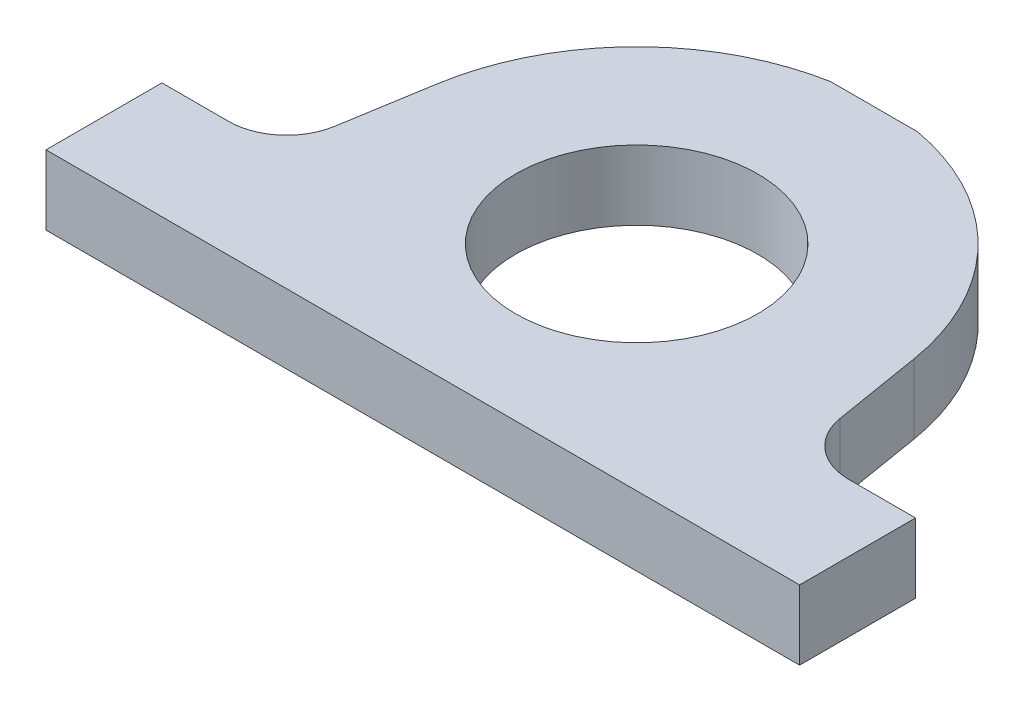
ISO-10303-21;
HEADER;
FILE_DESCRIPTION(('STEP AP214'),'2;1');
FILE_NAME('part.step','',(''),(''),'','','');
FILE_SCHEMA(('AUTOMOTIVE_DESIGN { 1 0 10303 214 1 1 1 1 }'));
ENDSEC;
DATA;
#1=APPLICATION_CONTEXT('core data for automotive mechanical design processes');
#2=APPLICATION_PROTOCOL_DEFINITION('international standard','automotive_design',2000,#1);
#3=PRODUCT_CONTEXT('',#1,'mechanical');
#4=PRODUCT('Part','Part','',(#3));
#5=PRODUCT_RELATED_PRODUCT_CATEGORY('part','',(#4));
#6=PRODUCT_DEFINITION_FORMATION('','',#4);
#7=PRODUCT_DEFINITION_CONTEXT('part definition',#1,'design');
#8=PRODUCT_DEFINITION('design','',#6,#7);
#9=PRODUCT_DEFINITION_SHAPE('','',#8);
#10=(LENGTH_UNIT() NAMED_UNIT(*) SI_UNIT(.MILLI.,.METRE.));
#11=(NAMED_UNIT(*) PLANE_ANGLE_UNIT() SI_UNIT($,.RADIAN.));
#12=(NAMED_UNIT(*) SI_UNIT($,.STERADIAN.) SOLID_ANGLE_UNIT());
#13=UNCERTAINTY_MEASURE_WITH_UNIT(LENGTH_MEASURE(1.E-05),#10,'distance_accuracy_value','');
#14=(GEOMETRIC_REPRESENTATION_CONTEXT(3) GLOBAL_UNCERTAINTY_ASSIGNED_CONTEXT((#13)) GLOBAL_UNIT_ASSIGNED_CONTEXT((#10,
#11,#12)) REPRESENTATION_CONTEXT('',''));
#15=CARTESIAN_POINT('',(0.,0.,0.));
#16=DIRECTION('',(0.,0.,1.));
#17=DIRECTION('',(1.,0.,0.));
#18=AXIS2_PLACEMENT_3D('',#15,#16,#17);
#19=CARTESIAN_POINT('',(0.,12.,0.));
#20=DIRECTION('',(0.,-1.,0.));
#21=DIRECTION('',(0.,0.,-1.));
#22=AXIS2_PLACEMENT_3D('',#19,#20,#21);
#23=CYLINDRICAL_SURFACE('',#22,41.65);
#24=CARTESIAN_POINT('',(0.,12.,0.));
#25=DIRECTION('',(0.,1.,0.));
#26=DIRECTION('',(0.,0.,1.));
#27=AXIS2_PLACEMENT_3D('',#24,#25,#26);
#28=CIRCLE('',#27,41.65);
#29=CARTESIAN_POINT('',(-7.5,12.,-40.9691652343564));
#30=VERTEX_POINT('',#29);
#31=CARTESIAN_POINT('',(-41.0948202807787,12.,-6.77777589556466));
#32=VERTEX_POINT('',#31);
#33=EDGE_CURVE('E136',#30,#32,#28,.T.);
#34=ORIENTED_EDGE('',*,*,#33,.F.);
#35=DIRECTION('',(0.,-1.,0.));
#36=VECTOR('',#35,1.);
#37=CARTESIAN_POINT('',(-7.5,12.,-40.9691652343564));
#38=LINE('',#37,#36);
#39=CARTESIAN_POINT('',(-7.5,0.,-40.9691652343564));
#40=VERTEX_POINT('',#39);
#41=EDGE_CURVE('E122',#30,#40,#38,.T.);
#42=ORIENTED_EDGE('',*,*,#41,.T.);
#43=CARTESIAN_POINT('',(0.,0.,0.));
#44=DIRECTION('',(0.,1.,0.));
#45=DIRECTION('',(0.,0.,1.));
#46=AXIS2_PLACEMENT_3D('',#43,#44,#45);
#47=CIRCLE('',#46,41.65);
#48=CARTESIAN_POINT('',(-41.0948202807787,0.,-6.77777589556466));
#49=VERTEX_POINT('',#48);
#50=EDGE_CURVE('E165',#40,#49,#47,.T.);
#51=ORIENTED_EDGE('',*,*,#50,.T.);
#52=DIRECTION('',(0.,-1.,0.));
#53=VECTOR('',#52,1.);
#54=CARTESIAN_POINT('',(-41.0948202807787,12.,-6.77777589556466));
#55=LINE('',#54,#53);
#56=EDGE_CURVE('E142',#32,#49,#55,.T.);
#57=ORIENTED_EDGE('',*,*,#56,.F.);
#58=EDGE_LOOP('',(#34,#42,#51,#57));
#59=FACE_BOUND('',#58,.T.);
#60=ADVANCED_FACE('F34',(#59),#23,.T.);
#61=CARTESIAN_POINT('',(0.,12.,0.));
#62=DIRECTION('',(0.,1.,0.));
#63=DIRECTION('',(0.,0.,1.));
#64=AXIS2_PLACEMENT_3D('',#61,#62,#63);
#65=PLANE('',#64);
#66=DIRECTION('',(-1.,0.,0.));
#67=VECTOR('',#66,1.);
#68=CARTESIAN_POINT('',(7.5,12.,-40.9691652343564));
#69=LINE('',#68,#67);
#70=CARTESIAN_POINT('',(7.5,12.,-40.9691652343564));
#71=VERTEX_POINT('',#70);
#72=EDGE_CURVE('E49',#71,#30,#69,.T.);
#73=ORIENTED_EDGE('',*,*,#72,.T.);
#74=ORIENTED_EDGE('',*,*,#33,.T.);
#75=DIRECTION('',(-0.162731714179224,0.,0.986670354880642));
#76=VECTOR('',#75,1.);
#77=CARTESIAN_POINT('',(-41.0948202807787,12.,-6.77777589556466));
#78=LINE('',#77,#76);
#79=CARTESIAN_POINT('',(-43.6190919519823,12.,8.52731714179223));
#80=VERTEX_POINT('',#79);
#81=EDGE_CURVE('E145',#32,#80,#78,.T.);
#82=ORIENTED_EDGE('',*,*,#81,.T.);
#83=CARTESIAN_POINT('',(-53.4857955007887,12.,6.9));
#84=DIRECTION('',(0.,1.,0.));
#85=DIRECTION('',(0.,0.,1.));
#86=AXIS2_PLACEMENT_3D('',#83,#84,#85);
#87=CIRCLE('',#86,10.);
#88=CARTESIAN_POINT('',(-53.4857955007887,12.,16.9));
#89=VERTEX_POINT('',#88);
#90=EDGE_CURVE('E11',#80,#89,#87,.F.);
#91=ORIENTED_EDGE('',*,*,#90,.T.);
#92=DIRECTION('',(-1.,0.,0.));
#93=VECTOR('',#92,1.);
#94=CARTESIAN_POINT('',(-65.,12.,16.9));
#95=LINE('',#94,#93);
#96=CARTESIAN_POINT('',(-65.,12.,16.9));
#97=VERTEX_POINT('',#96);
#98=EDGE_CURVE('E171',#89,#97,#95,.T.);
#99=ORIENTED_EDGE('',*,*,#98,.T.);
#100=DIRECTION('',(0.,0.,1.));
#101=VECTOR('',#100,1.);
#102=CARTESIAN_POINT('',(-65.,12.,16.9));
#103=LINE('',#102,#101);
#104=CARTESIAN_POINT('',(-65.,12.,36.9));
#105=VERTEX_POINT('',#104);
#106=EDGE_CURVE('E215',#97,#105,#103,.T.);
#107=ORIENTED_EDGE('',*,*,#106,.T.);
#108=DIRECTION('',(1.,0.,0.));
#109=VECTOR('',#108,1.);
#110=CARTESIAN_POINT('',(-65.,12.,36.9));
#111=LINE('',#110,#109);
#112=CARTESIAN_POINT('',(65.,12.,36.9));
#113=VERTEX_POINT('',#112);
#114=EDGE_CURVE('E217',#105,#113,#111,.T.);
#115=ORIENTED_EDGE('',*,*,#114,.T.);
#116=DIRECTION('',(0.,0.,-1.));
#117=VECTOR('',#116,1.);
#118=CARTESIAN_POINT('',(65.,12.,16.9));
#119=LINE('',#118,#117);
#120=CARTESIAN_POINT('',(65.,12.,16.9));
#121=VERTEX_POINT('',#120);
#122=EDGE_CURVE('E224',#113,#121,#119,.T.);
#123=ORIENTED_EDGE('',*,*,#122,.T.);
#124=DIRECTION('',(-1.,0.,0.));
#125=VECTOR('',#124,1.);
#126=CARTESIAN_POINT('',(45.,12.,16.9));
#127=LINE('',#126,#125);
#128=CARTESIAN_POINT('',(53.4857955007887,12.,16.9));
#129=VERTEX_POINT('',#128);
#130=EDGE_CURVE('E146',#121,#129,#127,.T.);
#131=ORIENTED_EDGE('',*,*,#130,.T.);
#132=CARTESIAN_POINT('',(53.4857955007887,12.,6.89999999999999));
#133=DIRECTION('',(0.,1.,0.));
#134=DIRECTION('',(0.,0.,1.));
#135=AXIS2_PLACEMENT_3D('',#132,#133,#134);
#136=CIRCLE('',#135,10.);
#137=CARTESIAN_POINT('',(43.6190919519823,12.,8.52731714179222));
#138=VERTEX_POINT('',#137);
#139=EDGE_CURVE('E199',#129,#138,#136,.F.);
#140=ORIENTED_EDGE('',*,*,#139,.T.);
#141=DIRECTION('',(-0.162731714179224,0.,-0.986670354880642));
#142=VECTOR('',#141,1.);
#143=CARTESIAN_POINT('',(41.0948202807787,12.,-6.77777589556467));
#144=LINE('',#143,#142);
#145=CARTESIAN_POINT('',(41.0948202807787,12.,-6.77777589556467));
#146=VERTEX_POINT('',#145);
#147=EDGE_CURVE('E143',#138,#146,#144,.T.);
#148=ORIENTED_EDGE('',*,*,#147,.T.);
#149=EDGE_CURVE('E139',#146,#71,#28,.T.);
#150=ORIENTED_EDGE('',*,*,#149,.T.);
#151=EDGE_LOOP('',(#73,#74,#82,#91,#99,#107,#115,#123,#131,#140,#148,#150));
#152=FACE_BOUND('',#151,.T.);
#153=CARTESIAN_POINT('',(0.,12.,0.));
#154=DIRECTION('',(0.,1.,0.));
#155=DIRECTION('',(0.,0.,1.));
#156=AXIS2_PLACEMENT_3D('',#153,#154,#155);
#157=CIRCLE('',#156,20.9);
#158=CARTESIAN_POINT('',(0.,12.,20.9));
#159=VERTEX_POINT('',#158);
#160=EDGE_CURVE('E154',#159,#159,#157,.T.);
#161=ORIENTED_EDGE('',*,*,#160,.F.);
#162=EDGE_LOOP('',(#161));
#163=FACE_BOUND('',#162,.T.);
#164=ADVANCED_FACE('F134',(#152,#163),#65,.T.);
#165=CARTESIAN_POINT('',(0.,0.,0.));
#166=DIRECTION('',(0.,1.,0.));
#167=DIRECTION('',(0.,0.,1.));
#168=AXIS2_PLACEMENT_3D('',#165,#166,#167);
#169=PLANE('',#168);
#170=ORIENTED_EDGE('',*,*,#50,.F.);
#171=DIRECTION('',(-1.,0.,0.));
#172=VECTOR('',#171,1.);
#173=CARTESIAN_POINT('',(7.5,0.,-40.9691652343564));
#174=LINE('',#173,#172);
#175=CARTESIAN_POINT('',(7.5,0.,-40.9691652343564));
#176=VERTEX_POINT('',#175);
#177=EDGE_CURVE('E125',#176,#40,#174,.T.);
#178=ORIENTED_EDGE('',*,*,#177,.F.);
#179=CARTESIAN_POINT('',(41.0948202807787,0.,-6.77777589556467));
#180=VERTEX_POINT('',#179);
#181=EDGE_CURVE('E166',#180,#176,#47,.T.);
#182=ORIENTED_EDGE('',*,*,#181,.F.);
#183=DIRECTION('',(-0.162731714179224,0.,-0.986670354880642));
#184=VECTOR('',#183,1.);
#185=CARTESIAN_POINT('',(41.0948202807787,0.,-6.77777589556467));
#186=LINE('',#185,#184);
#187=CARTESIAN_POINT('',(43.6190919519823,0.,8.52731714179222));
#188=VERTEX_POINT('',#187);
#189=EDGE_CURVE('E163',#188,#180,#186,.T.);
#190=ORIENTED_EDGE('',*,*,#189,.F.);
#191=CARTESIAN_POINT('',(53.4857955007887,0.,6.89999999999999));
#192=DIRECTION('',(0.,1.,0.));
#193=DIRECTION('',(0.,0.,1.));
#194=AXIS2_PLACEMENT_3D('',#191,#192,#193);
#195=CIRCLE('',#194,10.);
#196=CARTESIAN_POINT('',(53.4857955007887,0.,16.9));
#197=VERTEX_POINT('',#196);
#198=EDGE_CURVE('E197',#188,#197,#195,.T.);
#199=ORIENTED_EDGE('',*,*,#198,.T.);
#200=DIRECTION('',(-1.,0.,0.));
#201=VECTOR('',#200,1.);
#202=CARTESIAN_POINT('',(45.,0.,16.9));
#203=LINE('',#202,#201);
#204=CARTESIAN_POINT('',(65.,0.,16.9));
#205=VERTEX_POINT('',#204);
#206=EDGE_CURVE('E160',#205,#197,#203,.T.);
#207=ORIENTED_EDGE('',*,*,#206,.F.);
#208=DIRECTION('',(0.,0.,-1.));
#209=VECTOR('',#208,1.);
#210=CARTESIAN_POINT('',(65.,0.,16.9));
#211=LINE('',#210,#209);
#212=CARTESIAN_POINT('',(65.,0.,36.9));
#213=VERTEX_POINT('',#212);
#214=EDGE_CURVE('E158',#213,#205,#211,.T.);
#215=ORIENTED_EDGE('',*,*,#214,.F.);
#216=DIRECTION('',(1.,0.,0.));
#217=VECTOR('',#216,1.);
#218=CARTESIAN_POINT('',(-65.,0.,36.9));
#219=LINE('',#218,#217);
#220=CARTESIAN_POINT('',(-65.,0.,36.9));
#221=VERTEX_POINT('',#220);
#222=EDGE_CURVE('E156',#221,#213,#219,.T.);
#223=ORIENTED_EDGE('',*,*,#222,.F.);
#224=DIRECTION('',(0.,0.,1.));
#225=VECTOR('',#224,1.);
#226=CARTESIAN_POINT('',(-65.,0.,16.9));
#227=LINE('',#226,#225);
#228=CARTESIAN_POINT('',(-65.,0.,16.9));
#229=VERTEX_POINT('',#228);
#230=EDGE_CURVE('E153',#229,#221,#227,.T.);
#231=ORIENTED_EDGE('',*,*,#230,.F.);
#232=DIRECTION('',(-1.,0.,0.));
#233=VECTOR('',#232,1.);
#234=CARTESIAN_POINT('',(-65.,0.,16.9));
#235=LINE('',#234,#233);
#236=CARTESIAN_POINT('',(-53.4857955007887,0.,16.9));
#237=VERTEX_POINT('',#236);
#238=EDGE_CURVE('E151',#237,#229,#235,.T.);
#239=ORIENTED_EDGE('',*,*,#238,.F.);
#240=CARTESIAN_POINT('',(-53.4857955007887,0.,6.9));
#241=DIRECTION('',(0.,1.,0.));
#242=DIRECTION('',(0.,0.,1.));
#243=AXIS2_PLACEMENT_3D('',#240,#241,#242);
#244=CIRCLE('',#243,10.);
#245=CARTESIAN_POINT('',(-43.6190919519823,0.,8.52731714179223));
#246=VERTEX_POINT('',#245);
#247=EDGE_CURVE('E42',#237,#246,#244,.T.);
#248=ORIENTED_EDGE('',*,*,#247,.T.);
#249=DIRECTION('',(-0.162731714179224,0.,0.986670354880642));
#250=VECTOR('',#249,1.);
#251=CARTESIAN_POINT('',(-41.0948202807787,0.,-6.77777589556466));
#252=LINE('',#251,#250);
#253=EDGE_CURVE('E169',#49,#246,#252,.T.);
#254=ORIENTED_EDGE('',*,*,#253,.F.);
#255=EDGE_LOOP('',(#170,#178,#182,#190,#199,#207,#215,#223,#231,#239,#248,#254));
#256=FACE_BOUND('',#255,.T.);
#257=CARTESIAN_POINT('',(0.,0.,0.));
#258=DIRECTION('',(0.,1.,0.));
#259=DIRECTION('',(0.,0.,1.));
#260=AXIS2_PLACEMENT_3D('',#257,#258,#259);
#261=CIRCLE('',#260,20.9);
#262=CARTESIAN_POINT('',(0.,0.,20.9));
#263=VERTEX_POINT('',#262);
#264=EDGE_CURVE('E220',#263,#263,#261,.T.);
#265=ORIENTED_EDGE('',*,*,#264,.T.);
#266=EDGE_LOOP('',(#265));
#267=FACE_BOUND('',#266,.T.);
#268=ADVANCED_FACE('F203',(#256,#267),#169,.F.);
#269=CARTESIAN_POINT('',(-65.,12.,16.9));
#270=DIRECTION('',(0.,0.,1.));
#271=DIRECTION('',(1.,0.,0.));
#272=AXIS2_PLACEMENT_3D('',#269,#270,#271);
#273=PLANE('',#272);
#274=CARTESIAN_POINT('',(-55.,6.,16.9));
#275=DIRECTION('',(0.,0.,-1.));
#276=DIRECTION('',(-1.,0.,0.));
#277=AXIS2_PLACEMENT_3D('',#274,#275,#276);
#278=CIRCLE('',#277,0.999999999999998);
#279=CARTESIAN_POINT('',(-56.,6.,16.9));
#280=VERTEX_POINT('',#279);
#281=EDGE_CURVE('E129',#280,#280,#278,.T.);
#282=ORIENTED_EDGE('',*,*,#281,.F.);
#283=EDGE_LOOP('',(#282));
#284=FACE_BOUND('',#283,.T.);
#285=ORIENTED_EDGE('',*,*,#98,.F.);
#286=DIRECTION('',(0.,-1.,0.));
#287=VECTOR('',#286,1.);
#288=CARTESIAN_POINT('',(-53.4857955007887,0.,16.9));
#289=LINE('',#288,#287);
#290=EDGE_CURVE('E193',#89,#237,#289,.T.);
#291=ORIENTED_EDGE('',*,*,#290,.T.);
#292=ORIENTED_EDGE('',*,*,#238,.T.);
#293=DIRECTION('',(0.,-1.,0.));
#294=VECTOR('',#293,1.);
#295=CARTESIAN_POINT('',(-65.,12.,16.9));
#296=LINE('',#295,#294);
#297=EDGE_CURVE('E185',#97,#229,#296,.T.);
#298=ORIENTED_EDGE('',*,*,#297,.F.);
#299=EDGE_LOOP('',(#285,#291,#292,#298));
#300=FACE_BOUND('',#299,.T.);
#301=ADVANCED_FACE('F214',(#284,#300),#273,.F.);
#302=CARTESIAN_POINT('',(-65.,12.,16.9));
#303=DIRECTION('',(1.,0.,0.));
#304=DIRECTION('',(0.,0.,-1.));
#305=AXIS2_PLACEMENT_3D('',#302,#303,#304);
#306=PLANE('',#305);
#307=ORIENTED_EDGE('',*,*,#230,.T.);
#308=DIRECTION('',(0.,-1.,0.));
#309=VECTOR('',#308,1.);
#310=CARTESIAN_POINT('',(-65.,12.,36.9));
#311=LINE('',#310,#309);
#312=EDGE_CURVE('E182',#105,#221,#311,.T.);
#313=ORIENTED_EDGE('',*,*,#312,.F.);
#314=ORIENTED_EDGE('',*,*,#106,.F.);
#315=ORIENTED_EDGE('',*,*,#297,.T.);
#316=EDGE_LOOP('',(#307,#313,#314,#315));
#317=FACE_BOUND('',#316,.T.);
#318=ADVANCED_FACE('F300',(#317),#306,.F.);
#319=CARTESIAN_POINT('',(-65.,12.,36.9));
#320=DIRECTION('',(0.,0.,-1.));
#321=DIRECTION('',(-1.,0.,0.));
#322=AXIS2_PLACEMENT_3D('',#319,#320,#321);
#323=PLANE('',#322);
#324=ORIENTED_EDGE('',*,*,#222,.T.);
#325=DIRECTION('',(0.,-1.,0.));
#326=VECTOR('',#325,1.);
#327=CARTESIAN_POINT('',(65.,12.,36.9));
#328=LINE('',#327,#326);
#329=EDGE_CURVE('E179',#113,#213,#328,.T.);
#330=ORIENTED_EDGE('',*,*,#329,.F.);
#331=ORIENTED_EDGE('',*,*,#114,.F.);
#332=ORIENTED_EDGE('',*,*,#312,.T.);
#333=EDGE_LOOP('',(#324,#330,#331,#332));
#334=FACE_BOUND('',#333,.T.);
#335=ADVANCED_FACE('F296',(#334),#323,.F.);
#336=CARTESIAN_POINT('',(65.,12.,16.9));
#337=DIRECTION('',(-1.,0.,0.));
#338=DIRECTION('',(0.,0.,1.));
#339=AXIS2_PLACEMENT_3D('',#336,#337,#338);
#340=PLANE('',#339);
#341=ORIENTED_EDGE('',*,*,#214,.T.);
#342=DIRECTION('',(0.,-1.,0.));
#343=VECTOR('',#342,1.);
#344=CARTESIAN_POINT('',(65.,12.,16.9));
#345=LINE('',#344,#343);
#346=EDGE_CURVE('E176',#121,#205,#345,.T.);
#347=ORIENTED_EDGE('',*,*,#346,.F.);
#348=ORIENTED_EDGE('',*,*,#122,.F.);
#349=ORIENTED_EDGE('',*,*,#329,.T.);
#350=EDGE_LOOP('',(#341,#347,#348,#349));
#351=FACE_BOUND('',#350,.T.);
#352=ADVANCED_FACE('F290',(#351),#340,.F.);
#353=CARTESIAN_POINT('',(45.,12.,16.9));
#354=DIRECTION('',(0.,0.,1.));
#355=DIRECTION('',(1.,0.,0.));
#356=AXIS2_PLACEMENT_3D('',#353,#354,#355);
#357=PLANE('',#356);
#358=CARTESIAN_POINT('',(55.,6.,16.9));
#359=DIRECTION('',(0.,0.,-1.));
#360=DIRECTION('',(-1.,0.,0.));
#361=AXIS2_PLACEMENT_3D('',#358,#359,#360);
#362=CIRCLE('',#361,0.999999999999998);
#363=CARTESIAN_POINT('',(54.,6.,16.9));
#364=VERTEX_POINT('',#363);
#365=EDGE_CURVE('E250',#364,#364,#362,.T.);
#366=ORIENTED_EDGE('',*,*,#365,.F.);
#367=EDGE_LOOP('',(#366));
#368=FACE_BOUND('',#367,.T.);
#369=ORIENTED_EDGE('',*,*,#206,.T.);
#370=DIRECTION('',(0.,-1.,0.));
#371=VECTOR('',#370,1.);
#372=CARTESIAN_POINT('',(53.4857955007887,12.,16.9));
#373=LINE('',#372,#371);
#374=EDGE_CURVE('E191',#197,#129,#373,.F.);
#375=ORIENTED_EDGE('',*,*,#374,.T.);
#376=ORIENTED_EDGE('',*,*,#130,.F.);
#377=ORIENTED_EDGE('',*,*,#346,.T.);
#378=EDGE_LOOP('',(#369,#375,#376,#377));
#379=FACE_BOUND('',#378,.T.);
#380=ADVANCED_FACE('F286',(#368,#379),#357,.F.);
#381=CARTESIAN_POINT('',(41.0948202807787,12.,-6.77777589556467));
#382=DIRECTION('',(-0.986670354880642,0.,0.162731714179224));
#383=DIRECTION('',(0.162731714179224,0.,0.986670354880642));
#384=AXIS2_PLACEMENT_3D('',#381,#382,#383);
#385=PLANE('',#384);
#386=ORIENTED_EDGE('',*,*,#147,.F.);
#387=DIRECTION('',(0.,-1.,0.));
#388=VECTOR('',#387,1.);
#389=CARTESIAN_POINT('',(43.6190919519823,0.,8.52731714179222));
#390=LINE('',#389,#388);
#391=EDGE_CURVE('E188',#138,#188,#390,.T.);
#392=ORIENTED_EDGE('',*,*,#391,.T.);
#393=ORIENTED_EDGE('',*,*,#189,.T.);
#394=DIRECTION('',(0.,-1.,0.));
#395=VECTOR('',#394,1.);
#396=CARTESIAN_POINT('',(41.0948202807787,12.,-6.77777589556467));
#397=LINE('',#396,#395);
#398=EDGE_CURVE('E173',#146,#180,#397,.T.);
#399=ORIENTED_EDGE('',*,*,#398,.F.);
#400=EDGE_LOOP('',(#386,#392,#393,#399));
#401=FACE_BOUND('',#400,.T.);
#402=ADVANCED_FACE('F238',(#401),#385,.F.);
#403=ORIENTED_EDGE('',*,*,#181,.T.);
#404=DIRECTION('',(0.,-1.,0.));
#405=VECTOR('',#404,1.);
#406=CARTESIAN_POINT('',(7.5,12.,-40.9691652343564));
#407=LINE('',#406,#405);
#408=EDGE_CURVE('E130',#71,#176,#407,.T.);
#409=ORIENTED_EDGE('',*,*,#408,.F.);
#410=ORIENTED_EDGE('',*,*,#149,.F.);
#411=ORIENTED_EDGE('',*,*,#398,.T.);
#412=EDGE_LOOP('',(#403,#409,#410,#411));
#413=FACE_BOUND('',#412,.T.);
#414=ADVANCED_FACE('F243',(#413),#23,.T.);
#415=CARTESIAN_POINT('',(-41.0948202807787,12.,-6.77777589556466));
#416=DIRECTION('',(0.986670354880642,0.,0.162731714179224));
#417=DIRECTION('',(0.162731714179224,0.,-0.986670354880642));
#418=AXIS2_PLACEMENT_3D('',#415,#416,#417);
#419=PLANE('',#418);
#420=ORIENTED_EDGE('',*,*,#253,.T.);
#421=DIRECTION('',(0.,-1.,0.));
#422=VECTOR('',#421,1.);
#423=CARTESIAN_POINT('',(-43.6190919519823,12.,8.52731714179224));
#424=LINE('',#423,#422);
#425=EDGE_CURVE('E57',#246,#80,#424,.F.);
#426=ORIENTED_EDGE('',*,*,#425,.T.);
#427=ORIENTED_EDGE('',*,*,#81,.F.);
#428=ORIENTED_EDGE('',*,*,#56,.T.);
#429=EDGE_LOOP('',(#420,#426,#427,#428));
#430=FACE_BOUND('',#429,.T.);
#431=ADVANCED_FACE('F208',(#430),#419,.F.);
#432=CARTESIAN_POINT('',(0.,12.,0.));
#433=DIRECTION('',(0.,-1.,0.));
#434=DIRECTION('',(0.,0.,-1.));
#435=AXIS2_PLACEMENT_3D('',#432,#433,#434);
#436=CYLINDRICAL_SURFACE('',#435,20.9);
#437=ORIENTED_EDGE('',*,*,#160,.T.);
#438=EDGE_LOOP('',(#437));
#439=FACE_BOUND('',#438,.T.);
#440=ORIENTED_EDGE('',*,*,#264,.F.);
#441=EDGE_LOOP('',(#440));
#442=FACE_BOUND('',#441,.T.);
#443=ADVANCED_FACE('F263',(#439,#442),#436,.F.);
#444=CARTESIAN_POINT('',(55.,6.,19.9));
#445=DIRECTION('',(0.,0.,-1.));
#446=DIRECTION('',(-1.,0.,0.));
#447=AXIS2_PLACEMENT_3D('',#444,#445,#446);
#448=CYLINDRICAL_SURFACE('',#447,0.999999999999998);
#449=CARTESIAN_POINT('',(55.,6.,19.9));
#450=DIRECTION('',(0.,0.,-1.));
#451=DIRECTION('',(-1.,0.,0.));
#452=AXIS2_PLACEMENT_3D('',#449,#450,#451);
#453=CIRCLE('',#452,0.999999999999998);
#454=CARTESIAN_POINT('',(54.,6.,19.9));
#455=VERTEX_POINT('',#454);
#456=EDGE_CURVE('E253',#455,#455,#453,.T.);
#457=ORIENTED_EDGE('',*,*,#456,.F.);
#458=EDGE_LOOP('',(#457));
#459=FACE_BOUND('',#458,.T.);
#460=ORIENTED_EDGE('',*,*,#365,.T.);
#461=EDGE_LOOP('',(#460));
#462=FACE_BOUND('',#461,.T.);
#463=ADVANCED_FACE('F265',(#459,#462),#448,.F.);
#464=CARTESIAN_POINT('',(55.,6.,19.9));
#465=DIRECTION('',(0.,0.,-1.));
#466=DIRECTION('',(-1.,0.,0.));
#467=AXIS2_PLACEMENT_3D('',#464,#465,#466);
#468=PLANE('',#467);
#469=ORIENTED_EDGE('',*,*,#456,.T.);
#470=EDGE_LOOP('',(#469));
#471=FACE_BOUND('',#470,.T.);
#472=ADVANCED_FACE('F271',(#471),#468,.T.);
#473=CARTESIAN_POINT('',(-55.,6.,19.9));
#474=DIRECTION('',(0.,0.,-1.));
#475=DIRECTION('',(-1.,0.,0.));
#476=AXIS2_PLACEMENT_3D('',#473,#474,#475);
#477=CYLINDRICAL_SURFACE('',#476,0.999999999999998);
#478=CARTESIAN_POINT('',(-55.,6.,19.9));
#479=DIRECTION('',(0.,0.,-1.));
#480=DIRECTION('',(-1.,0.,0.));
#481=AXIS2_PLACEMENT_3D('',#478,#479,#480);
#482=CIRCLE('',#481,0.999999999999998);
#483=CARTESIAN_POINT('',(-56.,6.,19.9));
#484=VERTEX_POINT('',#483);
#485=EDGE_CURVE('E247',#484,#484,#482,.T.);
#486=ORIENTED_EDGE('',*,*,#485,.F.);
#487=EDGE_LOOP('',(#486));
#488=FACE_BOUND('',#487,.T.);
#489=ORIENTED_EDGE('',*,*,#281,.T.);
#490=EDGE_LOOP('',(#489));
#491=FACE_BOUND('',#490,.T.);
#492=ADVANCED_FACE('F313',(#488,#491),#477,.F.);
#493=CARTESIAN_POINT('',(-55.,6.,19.9));
#494=DIRECTION('',(0.,0.,-1.));
#495=DIRECTION('',(-1.,0.,0.));
#496=AXIS2_PLACEMENT_3D('',#493,#494,#495);
#497=PLANE('',#496);
#498=ORIENTED_EDGE('',*,*,#485,.T.);
#499=EDGE_LOOP('',(#498));
#500=FACE_BOUND('',#499,.T.);
#501=ADVANCED_FACE('F308',(#500),#497,.T.);
#502=CARTESIAN_POINT('',(53.4857955007887,12.,6.89999999999999));
#503=DIRECTION('',(0.,1.,0.));
#504=DIRECTION('',(0.,0.,1.));
#505=AXIS2_PLACEMENT_3D('',#502,#503,#504);
#506=CYLINDRICAL_SURFACE('',#505,10.);
#507=ORIENTED_EDGE('',*,*,#139,.F.);
#508=ORIENTED_EDGE('',*,*,#374,.F.);
#509=ORIENTED_EDGE('',*,*,#198,.F.);
#510=ORIENTED_EDGE('',*,*,#391,.F.);
#511=EDGE_LOOP('',(#507,#508,#509,#510));
#512=FACE_BOUND('',#511,.T.);
#513=ADVANCED_FACE('F235',(#512),#506,.F.);
#514=CARTESIAN_POINT('',(-53.4857955007887,12.,6.9));
#515=DIRECTION('',(0.,1.,0.));
#516=DIRECTION('',(0.,0.,1.));
#517=AXIS2_PLACEMENT_3D('',#514,#515,#516);
#518=CYLINDRICAL_SURFACE('',#517,10.);
#519=ORIENTED_EDGE('',*,*,#90,.F.);
#520=ORIENTED_EDGE('',*,*,#425,.F.);
#521=ORIENTED_EDGE('',*,*,#247,.F.);
#522=ORIENTED_EDGE('',*,*,#290,.F.);
#523=EDGE_LOOP('',(#519,#520,#521,#522));
#524=FACE_BOUND('',#523,.T.);
#525=ADVANCED_FACE('F36',(#524),#518,.F.);
#526=CARTESIAN_POINT('',(7.5,12.,-40.9691652343564));
#527=DIRECTION('',(0.,0.,1.));
#528=DIRECTION('',(1.,0.,0.));
#529=AXIS2_PLACEMENT_3D('',#526,#527,#528);
#530=PLANE('',#529);
#531=CARTESIAN_POINT('',(0.,4.,-40.9691652343564));
#532=DIRECTION('',(0.,0.,-1.));
#533=DIRECTION('',(-1.,0.,0.));
#534=AXIS2_PLACEMENT_3D('',#531,#532,#533);
#535=CIRCLE('',#534,1.);
#536=CARTESIAN_POINT('',(-1.,4.,-40.9691652343564));
#537=VERTEX_POINT('',#536);
#538=EDGE_CURVE('E437',#537,#537,#535,.T.);
#539=ORIENTED_EDGE('',*,*,#538,.F.);
#540=EDGE_LOOP('',(#539));
#541=FACE_BOUND('',#540,.T.);
#542=ORIENTED_EDGE('',*,*,#177,.T.);
#543=ORIENTED_EDGE('',*,*,#41,.F.);
#544=ORIENTED_EDGE('',*,*,#72,.F.);
#545=ORIENTED_EDGE('',*,*,#408,.T.);
#546=EDGE_LOOP('',(#542,#543,#544,#545));
#547=FACE_BOUND('',#546,.T.);
#548=ADVANCED_FACE('F123',(#541,#547),#530,.F.);
#549=CARTESIAN_POINT('',(0.,4.,-38.9691652343564));
#550=DIRECTION('',(0.,0.,-1.));
#551=DIRECTION('',(-1.,0.,0.));
#552=AXIS2_PLACEMENT_3D('',#549,#550,#551);
#553=CYLINDRICAL_SURFACE('',#552,1.);
#554=CARTESIAN_POINT('',(0.,4.,-38.9691652343564));
#555=DIRECTION('',(0.,0.,-1.));
#556=DIRECTION('',(-1.,0.,0.));
#557=AXIS2_PLACEMENT_3D('',#554,#555,#556);
#558=CIRCLE('',#557,1.);
#559=CARTESIAN_POINT('',(-1.,4.,-38.9691652343564));
#560=VERTEX_POINT('',#559);
#561=EDGE_CURVE('E436',#560,#560,#558,.T.);
#562=ORIENTED_EDGE('',*,*,#561,.F.);
#563=EDGE_LOOP('',(#562));
#564=FACE_BOUND('',#563,.T.);
#565=ORIENTED_EDGE('',*,*,#538,.T.);
#566=EDGE_LOOP('',(#565));
#567=FACE_BOUND('',#566,.T.);
#568=ADVANCED_FACE('F412',(#564,#567),#553,.F.);
#569=CARTESIAN_POINT('',(0.,4.,-38.9691652343564));
#570=DIRECTION('',(0.,0.,-1.));
#571=DIRECTION('',(-1.,0.,0.));
#572=AXIS2_PLACEMENT_3D('',#569,#570,#571);
#573=PLANE('',#572);
#574=ORIENTED_EDGE('',*,*,#561,.T.);
#575=EDGE_LOOP('',(#574));
#576=FACE_BOUND('',#575,.T.);
#577=ADVANCED_FACE('F421',(#576),#573,.T.);
#578=CLOSED_SHELL('',(#60,#164,#268,#301,#318,#335,#352,#380,#402,#414,#431,#443,#463,#472,#492,
#501,#513,#525,#548,#568,#577));
#579=MANIFOLD_SOLID_BREP('B2',#578);
#580=ADVANCED_BREP_SHAPE_REPRESENTATION('',(#18,#579),#14);
#581=SHAPE_DEFINITION_REPRESENTATION(#9,#580);
ENDSEC;
END-ISO-10303-21;
